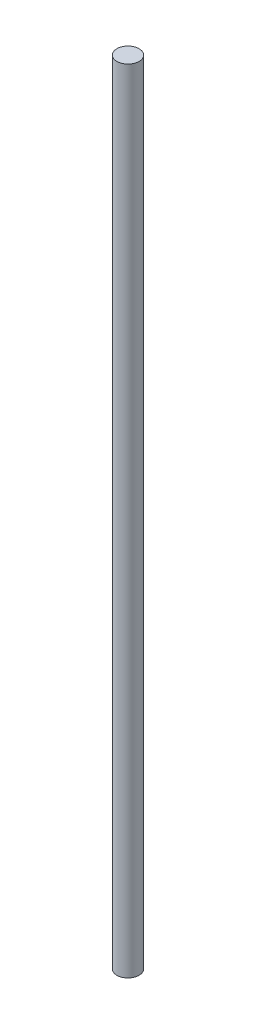
ISO-10303-21;
HEADER;
FILE_DESCRIPTION(('STEP AP214'),'2;1');
FILE_NAME('part.step','',(''),(''),'','','');
FILE_SCHEMA(('AUTOMOTIVE_DESIGN { 1 0 10303 214 1 1 1 1 }'));
ENDSEC;
DATA;
#1=APPLICATION_CONTEXT('core data for automotive mechanical design processes');
#2=APPLICATION_PROTOCOL_DEFINITION('international standard','automotive_design',2000,#1);
#3=PRODUCT_CONTEXT('',#1,'mechanical');
#4=PRODUCT('Part','Part','',(#3));
#5=PRODUCT_RELATED_PRODUCT_CATEGORY('part','',(#4));
#6=PRODUCT_DEFINITION_FORMATION('','',#4);
#7=PRODUCT_DEFINITION_CONTEXT('part definition',#1,'design');
#8=PRODUCT_DEFINITION('design','',#6,#7);
#9=PRODUCT_DEFINITION_SHAPE('','',#8);
#10=(LENGTH_UNIT() NAMED_UNIT(*) SI_UNIT(.MILLI.,.METRE.));
#11=(NAMED_UNIT(*) PLANE_ANGLE_UNIT() SI_UNIT($,.RADIAN.));
#12=(NAMED_UNIT(*) SI_UNIT($,.STERADIAN.) SOLID_ANGLE_UNIT());
#13=UNCERTAINTY_MEASURE_WITH_UNIT(LENGTH_MEASURE(1.E-05),#10,'distance_accuracy_value','');
#14=(GEOMETRIC_REPRESENTATION_CONTEXT(3) GLOBAL_UNCERTAINTY_ASSIGNED_CONTEXT((#13)) GLOBAL_UNIT_ASSIGNED_CONTEXT((#10,
#11,#12)) REPRESENTATION_CONTEXT('',''));
#15=CARTESIAN_POINT('',(0.,0.,0.));
#16=DIRECTION('',(0.,0.,1.));
#17=DIRECTION('',(1.,0.,0.));
#18=AXIS2_PLACEMENT_3D('',#15,#16,#17);
#19=CARTESIAN_POINT('',(0.,100.,0.));
#20=DIRECTION('',(0.,-1.,0.));
#21=DIRECTION('',(0.,0.,-1.));
#22=AXIS2_PLACEMENT_3D('',#19,#20,#21);
#23=CYLINDRICAL_SURFACE('',#22,1.4);
#24=CARTESIAN_POINT('',(0.,100.,0.));
#25=DIRECTION('',(0.,1.,0.));
#26=DIRECTION('',(0.,0.,1.));
#27=AXIS2_PLACEMENT_3D('',#24,#25,#26);
#28=CIRCLE('',#27,1.4);
#29=CARTESIAN_POINT('',(0.,100.,1.4));
#30=VERTEX_POINT('',#29);
#31=EDGE_CURVE('E10',#30,#30,#28,.T.);
#32=ORIENTED_EDGE('',*,*,#31,.F.);
#33=EDGE_LOOP('',(#32));
#34=FACE_BOUND('',#33,.T.);
#35=CARTESIAN_POINT('',(0.,0.,0.));
#36=DIRECTION('',(0.,1.,0.));
#37=DIRECTION('',(0.,0.,1.));
#38=AXIS2_PLACEMENT_3D('',#35,#36,#37);
#39=CIRCLE('',#38,1.4);
#40=CARTESIAN_POINT('',(0.,0.,1.4));
#41=VERTEX_POINT('',#40);
#42=EDGE_CURVE('E36',#41,#41,#39,.T.);
#43=ORIENTED_EDGE('',*,*,#42,.T.);
#44=EDGE_LOOP('',(#43));
#45=FACE_BOUND('',#44,.T.);
#46=ADVANCED_FACE('F33',(#34,#45),#23,.T.);
#47=CARTESIAN_POINT('',(0.,100.,0.));
#48=DIRECTION('',(0.,1.,0.));
#49=DIRECTION('',(0.,0.,1.));
#50=AXIS2_PLACEMENT_3D('',#47,#48,#49);
#51=PLANE('',#50);
#52=ORIENTED_EDGE('',*,*,#31,.T.);
#53=EDGE_LOOP('',(#52));
#54=FACE_BOUND('',#53,.T.);
#55=ADVANCED_FACE('F48',(#54),#51,.T.);
#56=CARTESIAN_POINT('',(0.,0.,0.));
#57=DIRECTION('',(0.,1.,0.));
#58=DIRECTION('',(0.,0.,1.));
#59=AXIS2_PLACEMENT_3D('',#56,#57,#58);
#60=PLANE('',#59);
#61=ORIENTED_EDGE('',*,*,#42,.F.);
#62=EDGE_LOOP('',(#61));
#63=FACE_BOUND('',#62,.T.);
#64=ADVANCED_FACE('F46',(#63),#60,.F.);
#65=CLOSED_SHELL('',(#46,#55,#64));
#66=MANIFOLD_SOLID_BREP('B2',#65);
#67=ADVANCED_BREP_SHAPE_REPRESENTATION('',(#18,#66),#14);
#68=SHAPE_DEFINITION_REPRESENTATION(#9,#67);
ENDSEC;
END-ISO-10303-21;
